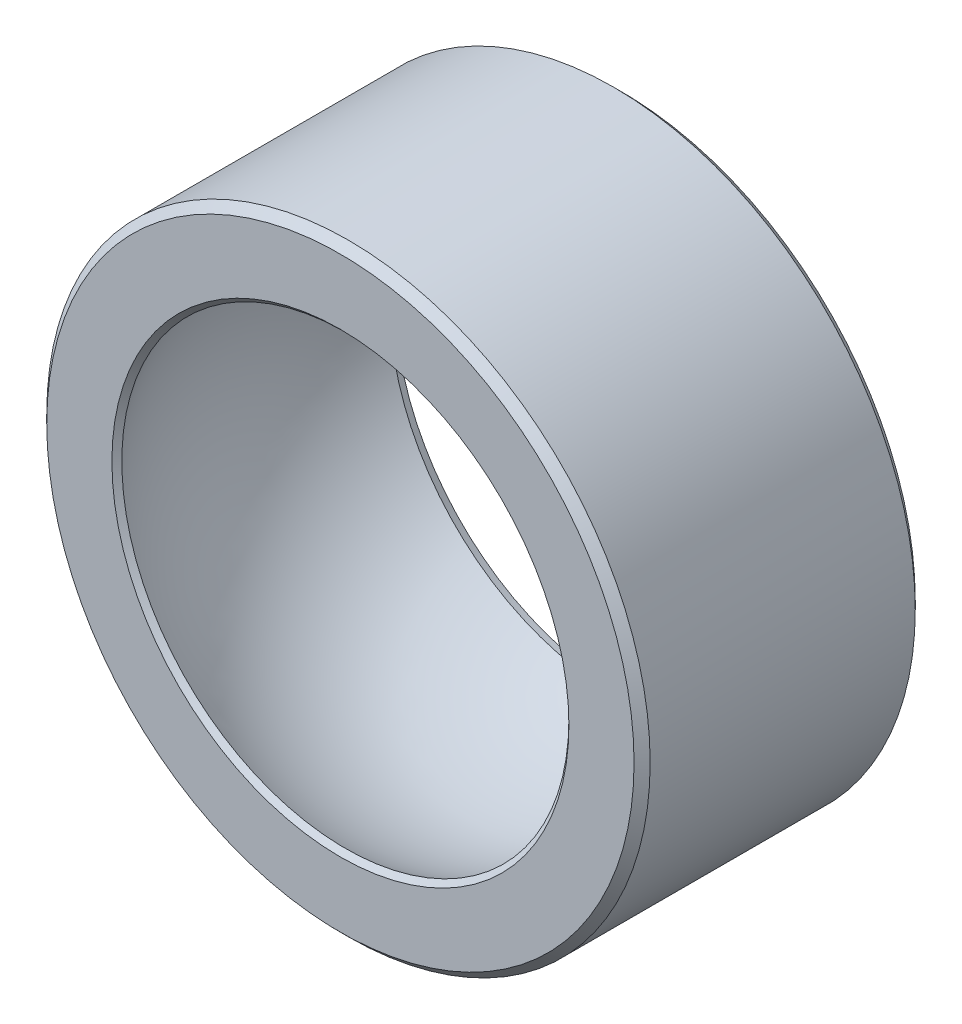
ISO-10303-21;
HEADER;
FILE_DESCRIPTION(('STEP AP214'),'2;1');
FILE_NAME('part.step','',(''),(''),'','','');
FILE_SCHEMA(('AUTOMOTIVE_DESIGN { 1 0 10303 214 1 1 1 1 }'));
ENDSEC;
DATA;
#1=APPLICATION_CONTEXT('core data for automotive mechanical design processes');
#2=APPLICATION_PROTOCOL_DEFINITION('international standard','automotive_design',2000,#1);
#3=PRODUCT_CONTEXT('',#1,'mechanical');
#4=PRODUCT('Part','Part','',(#3));
#5=PRODUCT_RELATED_PRODUCT_CATEGORY('part','',(#4));
#6=PRODUCT_DEFINITION_FORMATION('','',#4);
#7=PRODUCT_DEFINITION_CONTEXT('part definition',#1,'design');
#8=PRODUCT_DEFINITION('design','',#6,#7);
#9=PRODUCT_DEFINITION_SHAPE('','',#8);
#10=(LENGTH_UNIT() NAMED_UNIT(*) SI_UNIT(.MILLI.,.METRE.));
#11=(NAMED_UNIT(*) PLANE_ANGLE_UNIT() SI_UNIT($,.RADIAN.));
#12=(NAMED_UNIT(*) SI_UNIT($,.STERADIAN.) SOLID_ANGLE_UNIT());
#13=UNCERTAINTY_MEASURE_WITH_UNIT(LENGTH_MEASURE(1.E-05),#10,'distance_accuracy_value','');
#14=(GEOMETRIC_REPRESENTATION_CONTEXT(3) GLOBAL_UNCERTAINTY_ASSIGNED_CONTEXT((#13)) GLOBAL_UNIT_ASSIGNED_CONTEXT((#10,
#11,#12)) REPRESENTATION_CONTEXT('',''));
#15=CARTESIAN_POINT('',(0.,0.,0.));
#16=DIRECTION('',(0.,0.,1.));
#17=DIRECTION('',(1.,0.,0.));
#18=AXIS2_PLACEMENT_3D('',#15,#16,#17);
#19=CARTESIAN_POINT('',(0.,0.,3.495));
#20=DIRECTION('',(0.,0.,-1.));
#21=DIRECTION('',(-1.,0.,0.));
#22=AXIS2_PLACEMENT_3D('',#19,#20,#21);
#23=CYLINDRICAL_SURFACE('',#22,7.5);
#24=CARTESIAN_POINT('',(0.,0.,3.295));
#25=DIRECTION('',(0.,0.,1.));
#26=DIRECTION('',(1.,0.,0.));
#27=AXIS2_PLACEMENT_3D('',#24,#25,#26);
#28=CIRCLE('',#27,7.5);
#29=CARTESIAN_POINT('',(7.5,0.,3.295));
#30=VERTEX_POINT('',#29);
#31=EDGE_CURVE('E44',#30,#30,#28,.F.);
#32=ORIENTED_EDGE('',*,*,#31,.T.);
#33=EDGE_LOOP('',(#32));
#34=FACE_BOUND('',#33,.T.);
#35=CARTESIAN_POINT('',(0.,0.,-3.295));
#36=DIRECTION('',(0.,0.,1.));
#37=DIRECTION('',(1.,0.,0.));
#38=AXIS2_PLACEMENT_3D('',#35,#36,#37);
#39=CIRCLE('',#38,7.5);
#40=CARTESIAN_POINT('',(7.5,0.,-3.295));
#41=VERTEX_POINT('',#40);
#42=EDGE_CURVE('E48',#41,#41,#39,.T.);
#43=ORIENTED_EDGE('',*,*,#42,.T.);
#44=EDGE_LOOP('',(#43));
#45=FACE_BOUND('',#44,.T.);
#46=ADVANCED_FACE('F34',(#34,#45),#23,.T.);
#47=CARTESIAN_POINT('',(0.,0.,3.495));
#48=DIRECTION('',(0.,0.,1.));
#49=DIRECTION('',(1.,0.,0.));
#50=AXIS2_PLACEMENT_3D('',#47,#48,#49);
#51=PLANE('',#50);
#52=CARTESIAN_POINT('',(0.,0.,3.495));
#53=DIRECTION('',(0.,0.,1.));
#54=DIRECTION('',(1.,0.,0.));
#55=AXIS2_PLACEMENT_3D('',#52,#53,#54);
#56=CIRCLE('',#55,5.68041741111022);
#57=CARTESIAN_POINT('',(5.68041741111022,0.,3.495));
#58=VERTEX_POINT('',#57);
#59=EDGE_CURVE('E53',#58,#58,#56,.F.);
#60=ORIENTED_EDGE('',*,*,#59,.T.);
#61=EDGE_LOOP('',(#60));
#62=FACE_BOUND('',#61,.T.);
#63=CARTESIAN_POINT('',(0.,0.,3.495));
#64=DIRECTION('',(0.,0.,1.));
#65=DIRECTION('',(1.,0.,0.));
#66=AXIS2_PLACEMENT_3D('',#63,#64,#65);
#67=CIRCLE('',#66,7.3);
#68=CARTESIAN_POINT('',(7.3,0.,3.495));
#69=VERTEX_POINT('',#68);
#70=EDGE_CURVE('E56',#69,#69,#67,.T.);
#71=ORIENTED_EDGE('',*,*,#70,.T.);
#72=EDGE_LOOP('',(#71));
#73=FACE_BOUND('',#72,.T.);
#74=ADVANCED_FACE('F84',(#62,#73),#51,.T.);
#75=CARTESIAN_POINT('',(0.,0.,-3.495));
#76=DIRECTION('',(0.,0.,1.));
#77=DIRECTION('',(1.,0.,0.));
#78=AXIS2_PLACEMENT_3D('',#75,#76,#77);
#79=PLANE('',#78);
#80=CARTESIAN_POINT('',(0.,0.,-3.495));
#81=DIRECTION('',(0.,0.,1.));
#82=DIRECTION('',(1.,0.,0.));
#83=AXIS2_PLACEMENT_3D('',#80,#81,#82);
#84=CIRCLE('',#83,5.62525747151686);
#85=CARTESIAN_POINT('',(5.62525747151686,0.,-3.495));
#86=VERTEX_POINT('',#85);
#87=EDGE_CURVE('E10',#86,#86,#84,.T.);
#88=ORIENTED_EDGE('',*,*,#87,.T.);
#89=EDGE_LOOP('',(#88));
#90=FACE_BOUND('',#89,.T.);
#91=CARTESIAN_POINT('',(0.,0.,-3.495));
#92=DIRECTION('',(0.,0.,1.));
#93=DIRECTION('',(1.,0.,0.));
#94=AXIS2_PLACEMENT_3D('',#91,#92,#93);
#95=CIRCLE('',#94,7.3);
#96=CARTESIAN_POINT('',(7.3,0.,-3.495));
#97=VERTEX_POINT('',#96);
#98=EDGE_CURVE('E40',#97,#97,#95,.F.);
#99=ORIENTED_EDGE('',*,*,#98,.T.);
#100=EDGE_LOOP('',(#99));
#101=FACE_BOUND('',#100,.T.);
#102=ADVANCED_FACE('F89',(#90,#101),#79,.F.);
#103=CARTESIAN_POINT('',(0.,0.,0.));
#104=DIRECTION('',(0.,0.,-1.));
#105=DIRECTION('',(1.,0.,0.));
#106=AXIS2_PLACEMENT_3D('',#103,#104,#105);
#107=SPHERICAL_SURFACE('',#106,6.5);
#108=CARTESIAN_POINT('',(0.,0.,3.37170477045762));
#109=DIRECTION('',(0.,0.,-1.));
#110=DIRECTION('',(-1.,0.,0.));
#111=AXIS2_PLACEMENT_3D('',#108,#109,#110);
#112=CIRCLE('',#111,5.55712218156784);
#113=CARTESIAN_POINT('',(5.55712218156784,0.,3.37170477045762));
#114=VERTEX_POINT('',#113);
#115=EDGE_CURVE('E59',#114,#114,#112,.F.);
#116=CARTESIAN_POINT('',(0.,0.,-3.32198596257143));
#117=DIRECTION('',(0.,0.,1.));
#118=DIRECTION('',(1.,0.,0.));
#119=AXIS2_PLACEMENT_3D('',#116,#117,#118);
#120=CIRCLE('',#119,5.58698570469608);
#121=CARTESIAN_POINT('',(5.58698570469608,0.,-3.32198596257143));
#122=VERTEX_POINT('',#121);
#123=EDGE_CURVE('E62',#122,#122,#120,.F.);
#124=CARTESIAN_POINT('',(5.55712218156784,0.,3.37170477045762));
#125=CARTESIAN_POINT('',(5.59511725131178,0.,3.30908364604379));
#126=CARTESIAN_POINT('',(5.63205296345524,0.,3.2458198062816));
#127=CARTESIAN_POINT('',(5.70376541049714,0.,3.11808008236872));
#128=CARTESIAN_POINT('',(5.73854214539559,0.,3.05360419821804));
#129=CARTESIAN_POINT('',(5.80589637590342,0.,2.92351377183639));
#130=CARTESIAN_POINT('',(5.8384738715128,0.,2.85789922960543));
#131=CARTESIAN_POINT('',(5.90139253562066,0.,2.72560654568121));
#132=CARTESIAN_POINT('',(5.93173370411914,0.,2.65892840398795));
#133=CARTESIAN_POINT('',(5.99014500458498,0.,2.52458469572999));
#134=CARTESIAN_POINT('',(6.01821513655233,0.,2.45691912916529));
#135=CARTESIAN_POINT('',(6.0720522971967,0.,2.32067790076803));
#136=CARTESIAN_POINT('',(6.09781932587371,0.,2.25210223893546));
#137=CARTESIAN_POINT('',(6.14702083230281,0.,2.1141191824663));
#138=CARTESIAN_POINT('',(6.17045531005491,0.,2.04471178782972));
#139=CARTESIAN_POINT('',(6.21496493590044,0.,1.90514458058159));
#140=CARTESIAN_POINT('',(6.23604008399387,0.,1.83498476797006));
#141=CARTESIAN_POINT('',(6.27580696696945,0.,1.69399289890466));
#142=CARTESIAN_POINT('',(6.29449870185159,0.,1.6231608424508));
#143=CARTESIAN_POINT('',(6.32947739871201,0.,1.48090542816891));
#144=CARTESIAN_POINT('',(6.34576436069029,0.,1.40948207034087));
#145=CARTESIAN_POINT('',(6.37591490000875,0.,1.26612567144414));
#146=CARTESIAN_POINT('',(6.38977847734893,0.,1.19419263037546));
#147=CARTESIAN_POINT('',(6.41506640496677,0.,1.04989906557492));
#148=CARTESIAN_POINT('',(6.42649075524442,0.,0.977538541843067));
#149=CARTESIAN_POINT('',(6.44688717370401,0.,0.832472700791469));
#150=CARTESIAN_POINT('',(6.45585924188595,0.,0.75976738347172));
#151=CARTESIAN_POINT('',(6.47134084343664,0.,0.614095038328823));
#152=CARTESIAN_POINT('',(6.47785037680538,0.,0.541128010505674));
#153=CARTESIAN_POINT('',(6.48839947004245,0.,0.395015626506658));
#154=CARTESIAN_POINT('',(6.49243902991077,0.,0.321870270330792));
#155=CARTESIAN_POINT('',(6.49804355999092,0.,0.175484815559553));
#156=CARTESIAN_POINT('',(6.49960853020275,0.,0.102244716964181));
#157=CARTESIAN_POINT('',(6.50026209261995,0.,-0.0442465284471672));
#158=CARTESIAN_POINT('',(6.49935068482531,0.,-0.117497675263143));
#159=CARTESIAN_POINT('',(6.49505253272934,0.,-0.263927310291581));
#160=CARTESIAN_POINT('',(6.491665788428,0.,-0.337105798504043));
#161=CARTESIAN_POINT('',(6.48242083347794,0.,-0.483306492531026));
#162=CARTESIAN_POINT('',(6.47656262282922,0.,-0.556328698345546));
#163=CARTESIAN_POINT('',(6.46238142958078,0.,-0.702133382372008));
#164=CARTESIAN_POINT('',(6.45405844698108,0.,-0.774915860583949));
#165=CARTESIAN_POINT('',(6.4349572208138,0.,-0.92015791814612));
#166=CARTESIAN_POINT('',(6.42417897724623,0.,-0.99261749749635));
#167=CARTESIAN_POINT('',(6.40017954584612,0.,-1.13713095506527));
#168=CARTESIAN_POINT('',(6.38695835801358,0.,-1.20918483328395));
#169=CARTESIAN_POINT('',(6.35808814642544,0.,-1.3528045499272));
#170=CARTESIAN_POINT('',(6.34243912266984,0.,-1.42437038835177));
#171=CARTESIAN_POINT('',(6.30873112197402,0.,-1.56693224445521));
#172=CARTESIAN_POINT('',(6.2906721450338,0.,-1.63792826213408));
#173=CARTESIAN_POINT('',(6.25216487458489,0.,-1.77926934691385));
#174=CARTESIAN_POINT('',(6.23171658107622,0.,-1.84961441401474));
#175=CARTESIAN_POINT('',(6.18845404471382,0.,-1.98957321180695));
#176=CARTESIAN_POINT('',(6.16563980186009,0.,-2.05918694249828));
#177=CARTESIAN_POINT('',(6.11767143677217,0.,-2.1976035168608));
#178=CARTESIAN_POINT('',(6.09251731453797,0.,-2.266406360532));
#179=CARTESIAN_POINT('',(6.0398979379459,0.,-2.4031225387572));
#180=CARTESIAN_POINT('',(6.01243268358803,0.,-2.4710358733112));
#181=CARTESIAN_POINT('',(5.95522241824176,0.,-2.60589542065442));
#182=CARTESIAN_POINT('',(5.92547740725335,0.,-2.67284163344364));
#183=CARTESIAN_POINT('',(5.86374165700075,0.,-2.80569045599672));
#184=CARTESIAN_POINT('',(5.83175091773656,0.,-2.87159306576059));
#185=CARTESIAN_POINT('',(5.7655601275516,0.,-3.00227929570909));
#186=CARTESIAN_POINT('',(5.73136007663083,0.,-3.06706291589371));
#187=CARTESIAN_POINT('',(5.6607902687693,0.,-3.19543742405036));
#188=CARTESIAN_POINT('',(5.62442051182854,0.,-3.25902831202239));
#189=CARTESIAN_POINT('',(5.58698570469608,0.,-3.32198596257143));
#190=B_SPLINE_CURVE_WITH_KNOTS('',3,(#124,#125,#126,#127,#128,#129,#130,#131,#132,#133,#134,
#135,#136,#137,#138,#139,#140,#141,#142,#143,#144,#145,#146,#147,#148,#149,#150,#151,#152,#153,
#154,#155,#156,#157,#158,#159,#160,#161,#162,#163,#164,#165,#166,#167,#168,#169,#170,#171,#172,
#173,#174,#175,#176,#177,#178,#179,#180,#181,#182,#183,#184,#185,#186,#187,#188,#189),
.UNSPECIFIED.,.F.,.F.,(4,2,2,2,2,2,2,2,2,2,2,2,2,2,2,2,2,2,2,2,2,2,2,2,2,2,2,2,2,2,2,2,4),(0.,
0.219728593059509,0.439457186119019,0.659185779178529,0.878914372238039,1.09864296529755,
1.31837155835706,1.53810015141657,1.75782874447608,1.97755733753559,2.1972859305951,
2.41701452365461,2.63674311671412,2.85647170977363,3.07620030283314,3.29592889589265,
3.51565748895215,3.73538608201166,3.95511467507117,4.17484326813068,4.39457186119019,
4.6143004542497,4.83402904730921,5.05375764036872,5.27348623342823,5.49321482648774,
5.71294341954725,5.93267201260676,6.15240060566627,6.37212919872578,6.59185779178529,
6.8115863848448,7.03131497790431),.UNSPECIFIED.);
#191=EDGE_CURVE('BSEAM66',#114,#122,#190,.T.);
#192=ORIENTED_EDGE('',*,*,#115,.T.);
#193=ORIENTED_EDGE('',*,*,#123,.T.);
#194=ORIENTED_EDGE('',*,*,#191,.T.);
#195=ORIENTED_EDGE('',*,*,#191,.F.);
#196=EDGE_LOOP('',(#192,#194,#193,#195));
#197=FACE_BOUND('',#196,.T.);
#198=ADVANCED_FACE('F66',(#197),#107,.F.);
#199=CARTESIAN_POINT('',(0.,0.,3.37170477045762));
#200=DIRECTION('',(0.,0.,1.));
#201=DIRECTION('',(1.,0.,0.));
#202=AXIS2_PLACEMENT_3D('',#199,#200,#201);
#203=CONICAL_SURFACE('',#202,5.55712218156784,0.785398163397452);
#204=ORIENTED_EDGE('',*,*,#59,.F.);
#205=EDGE_LOOP('',(#204));
#206=FACE_BOUND('',#205,.T.);
#207=ORIENTED_EDGE('',*,*,#115,.F.);
#208=EDGE_LOOP('',(#207));
#209=FACE_BOUND('',#208,.T.);
#210=ADVANCED_FACE('F80',(#206,#209),#203,.F.);
#211=CARTESIAN_POINT('',(0.,0.,3.495));
#212=DIRECTION('',(0.,0.,-1.));
#213=DIRECTION('',(-1.,0.,0.));
#214=AXIS2_PLACEMENT_3D('',#211,#212,#213);
#215=CONICAL_SURFACE('',#214,7.3,0.785398163397448);
#216=ORIENTED_EDGE('',*,*,#31,.F.);
#217=EDGE_LOOP('',(#216));
#218=FACE_BOUND('',#217,.T.);
#219=ORIENTED_EDGE('',*,*,#70,.F.);
#220=EDGE_LOOP('',(#219));
#221=FACE_BOUND('',#220,.T.);
#222=ADVANCED_FACE('F72',(#218,#221),#215,.T.);
#223=CARTESIAN_POINT('',(0.,0.,-3.495));
#224=DIRECTION('',(0.,0.,-1.));
#225=DIRECTION('',(-1.,0.,0.));
#226=AXIS2_PLACEMENT_3D('',#223,#224,#225);
#227=CONICAL_SURFACE('',#226,5.62525747151686,0.217700468090253);
#228=ORIENTED_EDGE('',*,*,#123,.F.);
#229=EDGE_LOOP('',(#228));
#230=FACE_BOUND('',#229,.T.);
#231=ORIENTED_EDGE('',*,*,#87,.F.);
#232=EDGE_LOOP('',(#231));
#233=FACE_BOUND('',#232,.T.);
#234=ADVANCED_FACE('F68',(#230,#233),#227,.F.);
#235=CARTESIAN_POINT('',(0.,0.,-3.295));
#236=DIRECTION('',(0.,0.,1.));
#237=DIRECTION('',(1.,0.,0.));
#238=AXIS2_PLACEMENT_3D('',#235,#236,#237);
#239=CONICAL_SURFACE('',#238,7.5,0.785398163397444);
#240=ORIENTED_EDGE('',*,*,#98,.F.);
#241=EDGE_LOOP('',(#240));
#242=FACE_BOUND('',#241,.T.);
#243=ORIENTED_EDGE('',*,*,#42,.F.);
#244=EDGE_LOOP('',(#243));
#245=FACE_BOUND('',#244,.T.);
#246=ADVANCED_FACE('F71',(#242,#245),#239,.T.);
#247=CLOSED_SHELL('',(#46,#74,#102,#198,#210,#222,#234,#246));
#248=MANIFOLD_SOLID_BREP('B2',#247);
#249=ADVANCED_BREP_SHAPE_REPRESENTATION('',(#18,#248),#14);
#250=SHAPE_DEFINITION_REPRESENTATION(#9,#249);
ENDSEC;
END-ISO-10303-21;
